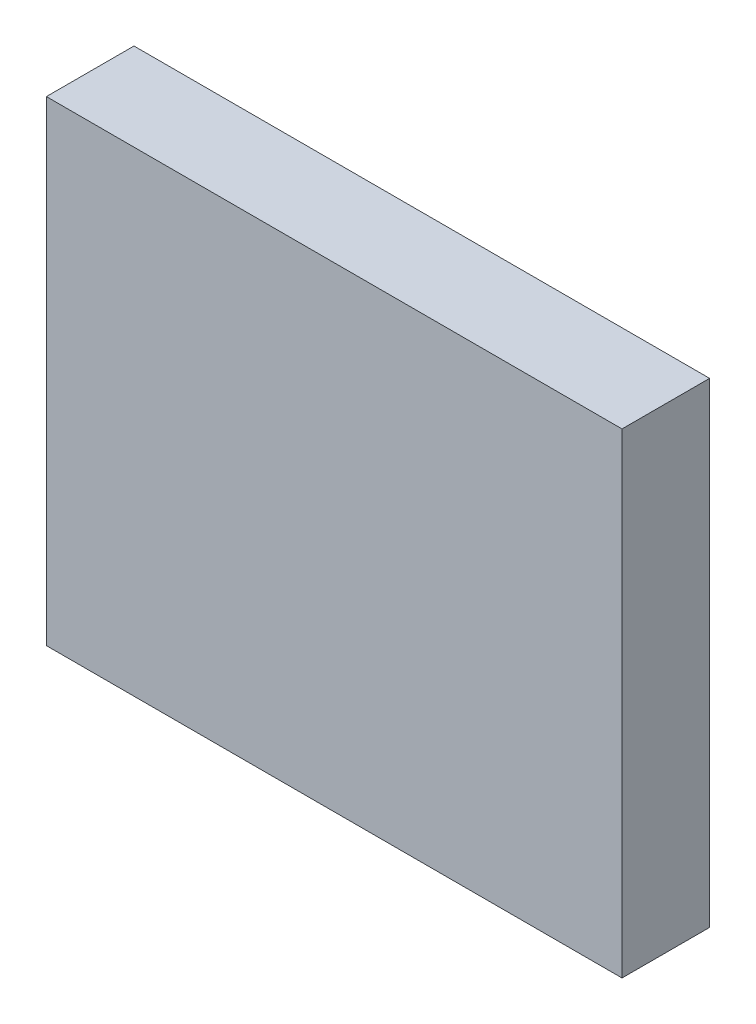
ISO-10303-21;
HEADER;
FILE_DESCRIPTION(('STEP AP214'),'2;1');
FILE_NAME('part.step','',(''),(''),'','','');
FILE_SCHEMA(('AUTOMOTIVE_DESIGN { 1 0 10303 214 1 1 1 1 }'));
ENDSEC;
DATA;
#1=APPLICATION_CONTEXT('core data for automotive mechanical design processes');
#2=APPLICATION_PROTOCOL_DEFINITION('international standard','automotive_design',2000,#1);
#3=PRODUCT_CONTEXT('',#1,'mechanical');
#4=PRODUCT('Part','Part','',(#3));
#5=PRODUCT_RELATED_PRODUCT_CATEGORY('part','',(#4));
#6=PRODUCT_DEFINITION_FORMATION('','',#4);
#7=PRODUCT_DEFINITION_CONTEXT('part definition',#1,'design');
#8=PRODUCT_DEFINITION('design','',#6,#7);
#9=PRODUCT_DEFINITION_SHAPE('','',#8);
#10=(LENGTH_UNIT() NAMED_UNIT(*) SI_UNIT(.MILLI.,.METRE.));
#11=(NAMED_UNIT(*) PLANE_ANGLE_UNIT() SI_UNIT($,.RADIAN.));
#12=(NAMED_UNIT(*) SI_UNIT($,.STERADIAN.) SOLID_ANGLE_UNIT());
#13=UNCERTAINTY_MEASURE_WITH_UNIT(LENGTH_MEASURE(1.E-05),#10,'distance_accuracy_value','');
#14=(GEOMETRIC_REPRESENTATION_CONTEXT(3) GLOBAL_UNCERTAINTY_ASSIGNED_CONTEXT((#13)) GLOBAL_UNIT_ASSIGNED_CONTEXT((#10,
#11,#12)) REPRESENTATION_CONTEXT('',''));
#15=CARTESIAN_POINT('',(0.,0.,0.));
#16=DIRECTION('',(0.,0.,1.));
#17=DIRECTION('',(1.,0.,0.));
#18=AXIS2_PLACEMENT_3D('',#15,#16,#17);
#19=CARTESIAN_POINT('',(-11.5,-9.5,1.75));
#20=DIRECTION('',(1.,0.,0.));
#21=DIRECTION('',(0.,0.,-1.));
#22=AXIS2_PLACEMENT_3D('',#19,#20,#21);
#23=PLANE('',#22);
#24=DIRECTION('',(0.,-1.,0.));
#25=VECTOR('',#24,1.);
#26=CARTESIAN_POINT('',(-11.5,-9.5,-1.75));
#27=LINE('',#26,#25);
#28=CARTESIAN_POINT('',(-11.5,9.5,-1.75));
#29=VERTEX_POINT('',#28);
#30=CARTESIAN_POINT('',(-11.5,-9.5,-1.75));
#31=VERTEX_POINT('',#30);
#32=EDGE_CURVE('E107',#29,#31,#27,.T.);
#33=ORIENTED_EDGE('',*,*,#32,.T.);
#34=DIRECTION('',(0.,0.,-1.));
#35=VECTOR('',#34,1.);
#36=CARTESIAN_POINT('',(-11.5,-9.5,1.75));
#37=LINE('',#36,#35);
#38=CARTESIAN_POINT('',(-11.5,-9.5,1.75));
#39=VERTEX_POINT('',#38);
#40=EDGE_CURVE('E11',#39,#31,#37,.T.);
#41=ORIENTED_EDGE('',*,*,#40,.F.);
#42=DIRECTION('',(0.,-1.,0.));
#43=VECTOR('',#42,1.);
#44=CARTESIAN_POINT('',(-11.5,-9.5,1.75));
#45=LINE('',#44,#43);
#46=CARTESIAN_POINT('',(-11.5,9.5,1.75));
#47=VERTEX_POINT('',#46);
#48=EDGE_CURVE('E91',#47,#39,#45,.T.);
#49=ORIENTED_EDGE('',*,*,#48,.F.);
#50=DIRECTION('',(0.,0.,-1.));
#51=VECTOR('',#50,1.);
#52=CARTESIAN_POINT('',(-11.5,9.5,1.75));
#53=LINE('',#52,#51);
#54=EDGE_CURVE('E103',#47,#29,#53,.T.);
#55=ORIENTED_EDGE('',*,*,#54,.T.);
#56=EDGE_LOOP('',(#33,#41,#49,#55));
#57=FACE_BOUND('',#56,.T.);
#58=ADVANCED_FACE('F39',(#57),#23,.F.);
#59=CARTESIAN_POINT('',(11.5,-9.5,1.75));
#60=DIRECTION('',(0.,1.,0.));
#61=DIRECTION('',(-1.,0.,0.));
#62=AXIS2_PLACEMENT_3D('',#59,#60,#61);
#63=PLANE('',#62);
#64=DIRECTION('',(1.,0.,0.));
#65=VECTOR('',#64,1.);
#66=CARTESIAN_POINT('',(11.5,-9.5,-1.75));
#67=LINE('',#66,#65);
#68=CARTESIAN_POINT('',(11.5,-9.5,-1.75));
#69=VERTEX_POINT('',#68);
#70=EDGE_CURVE('E96',#31,#69,#67,.T.);
#71=ORIENTED_EDGE('',*,*,#70,.T.);
#72=DIRECTION('',(0.,0.,-1.));
#73=VECTOR('',#72,1.);
#74=CARTESIAN_POINT('',(11.5,-9.5,1.75));
#75=LINE('',#74,#73);
#76=CARTESIAN_POINT('',(11.5,-9.5,1.75));
#77=VERTEX_POINT('',#76);
#78=EDGE_CURVE('E48',#77,#69,#75,.T.);
#79=ORIENTED_EDGE('',*,*,#78,.F.);
#80=DIRECTION('',(1.,0.,0.));
#81=VECTOR('',#80,1.);
#82=CARTESIAN_POINT('',(11.5,-9.5,1.75));
#83=LINE('',#82,#81);
#84=EDGE_CURVE('E86',#39,#77,#83,.T.);
#85=ORIENTED_EDGE('',*,*,#84,.F.);
#86=ORIENTED_EDGE('',*,*,#40,.T.);
#87=EDGE_LOOP('',(#71,#79,#85,#86));
#88=FACE_BOUND('',#87,.T.);
#89=ADVANCED_FACE('F95',(#88),#63,.F.);
#90=CARTESIAN_POINT('',(11.5,-9.5,1.75));
#91=DIRECTION('',(-1.,0.,0.));
#92=DIRECTION('',(0.,0.,1.));
#93=AXIS2_PLACEMENT_3D('',#90,#91,#92);
#94=PLANE('',#93);
#95=DIRECTION('',(0.,1.,0.));
#96=VECTOR('',#95,1.);
#97=CARTESIAN_POINT('',(11.5,-9.5,-1.75));
#98=LINE('',#97,#96);
#99=CARTESIAN_POINT('',(11.5,9.5,-1.75));
#100=VERTEX_POINT('',#99);
#101=EDGE_CURVE('E73',#69,#100,#98,.T.);
#102=ORIENTED_EDGE('',*,*,#101,.T.);
#103=DIRECTION('',(0.,0.,-1.));
#104=VECTOR('',#103,1.);
#105=CARTESIAN_POINT('',(11.5,9.5,1.75));
#106=LINE('',#105,#104);
#107=CARTESIAN_POINT('',(11.5,9.5,1.75));
#108=VERTEX_POINT('',#107);
#109=EDGE_CURVE('E98',#108,#100,#106,.T.);
#110=ORIENTED_EDGE('',*,*,#109,.F.);
#111=DIRECTION('',(0.,1.,0.));
#112=VECTOR('',#111,1.);
#113=CARTESIAN_POINT('',(11.5,-9.5,1.75));
#114=LINE('',#113,#112);
#115=EDGE_CURVE('E89',#77,#108,#114,.T.);
#116=ORIENTED_EDGE('',*,*,#115,.F.);
#117=ORIENTED_EDGE('',*,*,#78,.T.);
#118=EDGE_LOOP('',(#102,#110,#116,#117));
#119=FACE_BOUND('',#118,.T.);
#120=ADVANCED_FACE('F99',(#119),#94,.F.);
#121=CARTESIAN_POINT('',(11.5,9.5,1.75));
#122=DIRECTION('',(0.,-1.,0.));
#123=DIRECTION('',(1.,0.,0.));
#124=AXIS2_PLACEMENT_3D('',#121,#122,#123);
#125=PLANE('',#124);
#126=DIRECTION('',(-1.,0.,0.));
#127=VECTOR('',#126,1.);
#128=CARTESIAN_POINT('',(11.5,9.5,-1.75));
#129=LINE('',#128,#127);
#130=EDGE_CURVE('E79',#100,#29,#129,.T.);
#131=ORIENTED_EDGE('',*,*,#130,.T.);
#132=ORIENTED_EDGE('',*,*,#54,.F.);
#133=DIRECTION('',(-1.,0.,0.));
#134=VECTOR('',#133,1.);
#135=CARTESIAN_POINT('',(11.5,9.5,1.75));
#136=LINE('',#135,#134);
#137=EDGE_CURVE('E56',#108,#47,#136,.T.);
#138=ORIENTED_EDGE('',*,*,#137,.F.);
#139=ORIENTED_EDGE('',*,*,#109,.T.);
#140=EDGE_LOOP('',(#131,#132,#138,#139));
#141=FACE_BOUND('',#140,.T.);
#142=ADVANCED_FACE('F120',(#141),#125,.F.);
#143=CARTESIAN_POINT('',(0.,0.,1.75));
#144=DIRECTION('',(0.,0.,1.));
#145=DIRECTION('',(1.,0.,0.));
#146=AXIS2_PLACEMENT_3D('',#143,#144,#145);
#147=PLANE('',#146);
#148=ORIENTED_EDGE('',*,*,#48,.T.);
#149=ORIENTED_EDGE('',*,*,#84,.T.);
#150=ORIENTED_EDGE('',*,*,#115,.T.);
#151=ORIENTED_EDGE('',*,*,#137,.T.);
#152=EDGE_LOOP('',(#148,#149,#150,#151));
#153=FACE_BOUND('',#152,.T.);
#154=ADVANCED_FACE('F87',(#153),#147,.T.);
#155=CARTESIAN_POINT('',(0.,0.,-1.75));
#156=DIRECTION('',(0.,0.,1.));
#157=DIRECTION('',(1.,0.,0.));
#158=AXIS2_PLACEMENT_3D('',#155,#156,#157);
#159=PLANE('',#158);
#160=ORIENTED_EDGE('',*,*,#32,.F.);
#161=ORIENTED_EDGE('',*,*,#130,.F.);
#162=ORIENTED_EDGE('',*,*,#101,.F.);
#163=ORIENTED_EDGE('',*,*,#70,.F.);
#164=EDGE_LOOP('',(#160,#161,#162,#163));
#165=FACE_BOUND('',#164,.T.);
#166=ADVANCED_FACE('F123',(#165),#159,.F.);
#167=CLOSED_SHELL('',(#58,#89,#120,#142,#154,#166));
#168=MANIFOLD_SOLID_BREP('B2',#167);
#169=ADVANCED_BREP_SHAPE_REPRESENTATION('',(#18,#168),#14);
#170=SHAPE_DEFINITION_REPRESENTATION(#9,#169);
ENDSEC;
END-ISO-10303-21;
